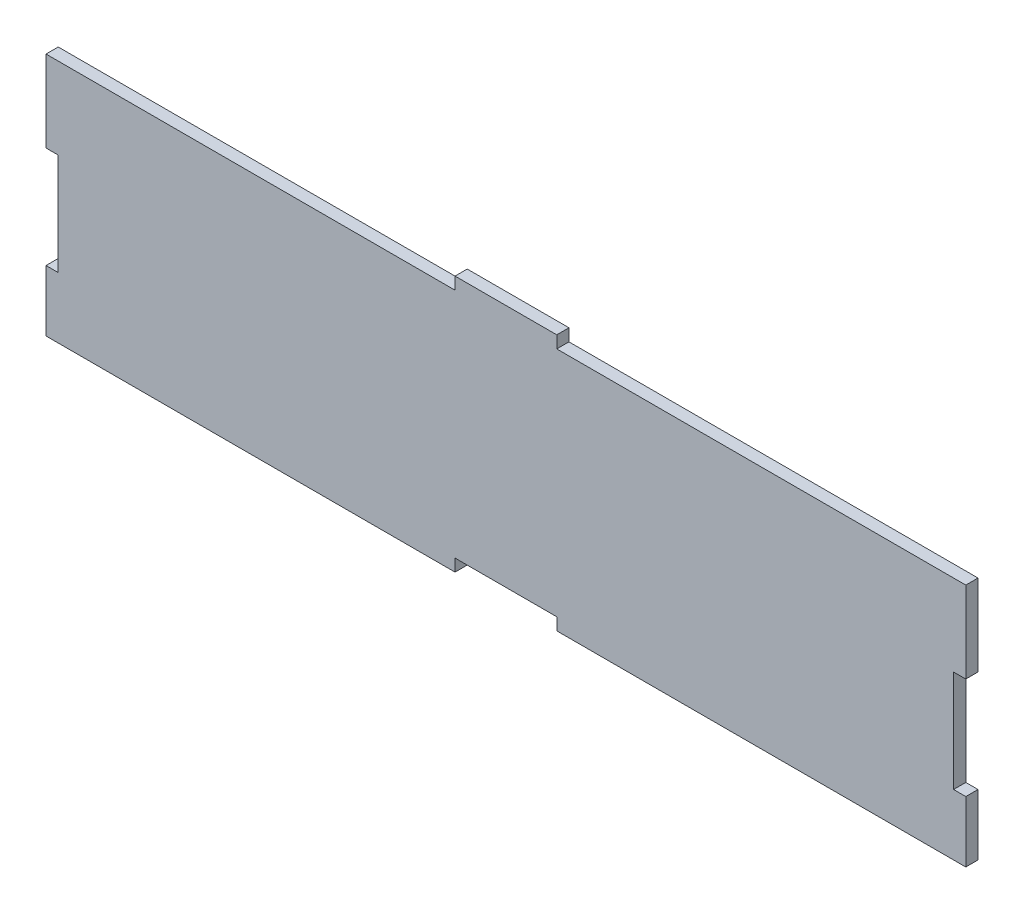
ISO-10303-21;
HEADER;
FILE_DESCRIPTION(('STEP AP214'),'2;1');
FILE_NAME('part.step','',(''),(''),'','','');
FILE_SCHEMA(('AUTOMOTIVE_DESIGN { 1 0 10303 214 1 1 1 1 }'));
ENDSEC;
DATA;
#1=APPLICATION_CONTEXT('core data for automotive mechanical design processes');
#2=APPLICATION_PROTOCOL_DEFINITION('international standard','automotive_design',2000,#1);
#3=PRODUCT_CONTEXT('',#1,'mechanical');
#4=PRODUCT('Part','Part','',(#3));
#5=PRODUCT_RELATED_PRODUCT_CATEGORY('part','',(#4));
#6=PRODUCT_DEFINITION_FORMATION('','',#4);
#7=PRODUCT_DEFINITION_CONTEXT('part definition',#1,'design');
#8=PRODUCT_DEFINITION('design','',#6,#7);
#9=PRODUCT_DEFINITION_SHAPE('','',#8);
#10=(LENGTH_UNIT() NAMED_UNIT(*) SI_UNIT(.MILLI.,.METRE.));
#11=(NAMED_UNIT(*) PLANE_ANGLE_UNIT() SI_UNIT($,.RADIAN.));
#12=(NAMED_UNIT(*) SI_UNIT($,.STERADIAN.) SOLID_ANGLE_UNIT());
#13=UNCERTAINTY_MEASURE_WITH_UNIT(LENGTH_MEASURE(1.E-05),#10,'distance_accuracy_value','');
#14=(GEOMETRIC_REPRESENTATION_CONTEXT(3) GLOBAL_UNCERTAINTY_ASSIGNED_CONTEXT((#13)) GLOBAL_UNIT_ASSIGNED_CONTEXT((#10,
#11,#12)) REPRESENTATION_CONTEXT('',''));
#15=CARTESIAN_POINT('',(0.,0.,0.));
#16=DIRECTION('',(0.,0.,1.));
#17=DIRECTION('',(1.,0.,0.));
#18=AXIS2_PLACEMENT_3D('',#15,#16,#17);
#19=CARTESIAN_POINT('',(-92.3153230930851,-18.9893617021276,3.));
#20=DIRECTION('',(1.,0.,0.));
#21=DIRECTION('',(0.,0.,-1.));
#22=AXIS2_PLACEMENT_3D('',#19,#20,#21);
#23=PLANE('',#22);
#24=DIRECTION('',(0.,-1.,0.));
#25=VECTOR('',#24,1.);
#26=CARTESIAN_POINT('',(-92.3153230930851,-18.9893617021276,0.));
#27=LINE('',#26,#25);
#28=CARTESIAN_POINT('',(-92.3153230930851,-18.9893617021276,0.));
#29=VERTEX_POINT('',#28);
#30=CARTESIAN_POINT('',(-92.3153230930851,-38.9893617021276,0.));
#31=VERTEX_POINT('',#30);
#32=EDGE_CURVE('E201',#29,#31,#27,.T.);
#33=ORIENTED_EDGE('',*,*,#32,.T.);
#34=DIRECTION('',(0.,0.,-1.));
#35=VECTOR('',#34,1.);
#36=CARTESIAN_POINT('',(-92.3153230930851,-38.9893617021276,3.));
#37=LINE('',#36,#35);
#38=CARTESIAN_POINT('',(-92.3153230930851,-38.9893617021276,3.));
#39=VERTEX_POINT('',#38);
#40=EDGE_CURVE('E11',#39,#31,#37,.T.);
#41=ORIENTED_EDGE('',*,*,#40,.F.);
#42=DIRECTION('',(0.,-1.,0.));
#43=VECTOR('',#42,1.);
#44=CARTESIAN_POINT('',(-92.3153230930851,-18.9893617021276,3.));
#45=LINE('',#44,#43);
#46=CARTESIAN_POINT('',(-92.3153230930851,-18.9893617021276,3.));
#47=VERTEX_POINT('',#46);
#48=EDGE_CURVE('E239',#47,#39,#45,.T.);
#49=ORIENTED_EDGE('',*,*,#48,.F.);
#50=DIRECTION('',(0.,0.,-1.));
#51=VECTOR('',#50,1.);
#52=CARTESIAN_POINT('',(-92.3153230930851,-18.9893617021276,3.));
#53=LINE('',#52,#51);
#54=EDGE_CURVE('E197',#47,#29,#53,.T.);
#55=ORIENTED_EDGE('',*,*,#54,.T.);
#56=EDGE_LOOP('',(#33,#41,#49,#55));
#57=FACE_BOUND('',#56,.T.);
#58=ADVANCED_FACE('F33',(#57),#23,.F.);
#59=CARTESIAN_POINT('',(-92.3153230930851,-38.9893617021276,3.));
#60=DIRECTION('',(0.,1.,0.));
#61=DIRECTION('',(0.,0.,1.));
#62=AXIS2_PLACEMENT_3D('',#59,#60,#61);
#63=PLANE('',#62);
#64=DIRECTION('',(1.,0.,0.));
#65=VECTOR('',#64,1.);
#66=CARTESIAN_POINT('',(-92.3153230930851,-38.9893617021276,0.));
#67=LINE('',#66,#65);
#68=CARTESIAN_POINT('',(-89.3153230930851,-38.9893617021276,0.));
#69=VERTEX_POINT('',#68);
#70=EDGE_CURVE('E204',#31,#69,#67,.T.);
#71=ORIENTED_EDGE('',*,*,#70,.T.);
#72=DIRECTION('',(0.,0.,-1.));
#73=VECTOR('',#72,1.);
#74=CARTESIAN_POINT('',(-89.3153230930851,-38.9893617021276,3.));
#75=LINE('',#74,#73);
#76=CARTESIAN_POINT('',(-89.3153230930851,-38.9893617021276,3.));
#77=VERTEX_POINT('',#76);
#78=EDGE_CURVE('E41',#77,#69,#75,.T.);
#79=ORIENTED_EDGE('',*,*,#78,.F.);
#80=DIRECTION('',(1.,0.,0.));
#81=VECTOR('',#80,1.);
#82=CARTESIAN_POINT('',(-92.3153230930851,-38.9893617021276,3.));
#83=LINE('',#82,#81);
#84=EDGE_CURVE('E128',#39,#77,#83,.T.);
#85=ORIENTED_EDGE('',*,*,#84,.F.);
#86=ORIENTED_EDGE('',*,*,#40,.T.);
#87=EDGE_LOOP('',(#71,#79,#85,#86));
#88=FACE_BOUND('',#87,.T.);
#89=ADVANCED_FACE('F357',(#88),#63,.F.);
#90=CARTESIAN_POINT('',(-89.3153230930851,-38.9893617021276,3.));
#91=DIRECTION('',(1.,0.,0.));
#92=DIRECTION('',(0.,0.,-1.));
#93=AXIS2_PLACEMENT_3D('',#90,#91,#92);
#94=PLANE('',#93);
#95=DIRECTION('',(0.,-1.,0.));
#96=VECTOR('',#95,1.);
#97=CARTESIAN_POINT('',(-89.3153230930851,-38.9893617021276,0.));
#98=LINE('',#97,#96);
#99=CARTESIAN_POINT('',(-89.3153230930851,-63.9893617021276,0.));
#100=VERTEX_POINT('',#99);
#101=EDGE_CURVE('E206',#69,#100,#98,.T.);
#102=ORIENTED_EDGE('',*,*,#101,.T.);
#103=DIRECTION('',(0.,0.,-1.));
#104=VECTOR('',#103,1.);
#105=CARTESIAN_POINT('',(-89.3153230930851,-63.9893617021276,3.));
#106=LINE('',#105,#104);
#107=CARTESIAN_POINT('',(-89.3153230930851,-63.9893617021276,3.));
#108=VERTEX_POINT('',#107);
#109=EDGE_CURVE('E282',#108,#100,#106,.T.);
#110=ORIENTED_EDGE('',*,*,#109,.F.);
#111=DIRECTION('',(0.,-1.,0.));
#112=VECTOR('',#111,1.);
#113=CARTESIAN_POINT('',(-89.3153230930851,-38.9893617021276,3.));
#114=LINE('',#113,#112);
#115=EDGE_CURVE('E290',#77,#108,#114,.T.);
#116=ORIENTED_EDGE('',*,*,#115,.F.);
#117=ORIENTED_EDGE('',*,*,#78,.T.);
#118=EDGE_LOOP('',(#102,#110,#116,#117));
#119=FACE_BOUND('',#118,.T.);
#120=ADVANCED_FACE('F288',(#119),#94,.F.);
#121=CARTESIAN_POINT('',(-92.3153230930851,-63.9893617021276,3.));
#122=DIRECTION('',(0.,-1.,0.));
#123=DIRECTION('',(0.,0.,-1.));
#124=AXIS2_PLACEMENT_3D('',#121,#122,#123);
#125=PLANE('',#124);
#126=DIRECTION('',(-1.,0.,0.));
#127=VECTOR('',#126,1.);
#128=CARTESIAN_POINT('',(-92.3153230930851,-63.9893617021276,0.));
#129=LINE('',#128,#127);
#130=CARTESIAN_POINT('',(-92.3153230930851,-63.9893617021276,0.));
#131=VERTEX_POINT('',#130);
#132=EDGE_CURVE('E208',#100,#131,#129,.T.);
#133=ORIENTED_EDGE('',*,*,#132,.T.);
#134=DIRECTION('',(0.,0.,-1.));
#135=VECTOR('',#134,1.);
#136=CARTESIAN_POINT('',(-92.3153230930851,-63.9893617021276,3.));
#137=LINE('',#136,#135);
#138=CARTESIAN_POINT('',(-92.3153230930851,-63.9893617021276,3.));
#139=VERTEX_POINT('',#138);
#140=EDGE_CURVE('E279',#139,#131,#137,.T.);
#141=ORIENTED_EDGE('',*,*,#140,.F.);
#142=DIRECTION('',(-1.,0.,0.));
#143=VECTOR('',#142,1.);
#144=CARTESIAN_POINT('',(-92.3153230930851,-63.9893617021276,3.));
#145=LINE('',#144,#143);
#146=EDGE_CURVE('E308',#108,#139,#145,.T.);
#147=ORIENTED_EDGE('',*,*,#146,.F.);
#148=ORIENTED_EDGE('',*,*,#109,.T.);
#149=EDGE_LOOP('',(#133,#141,#147,#148));
#150=FACE_BOUND('',#149,.T.);
#151=ADVANCED_FACE('F299',(#150),#125,.F.);
#152=CARTESIAN_POINT('',(-92.3153230930851,-63.9893617021276,3.));
#153=DIRECTION('',(1.,0.,0.));
#154=DIRECTION('',(0.,0.,-1.));
#155=AXIS2_PLACEMENT_3D('',#152,#153,#154);
#156=PLANE('',#155);
#157=DIRECTION('',(0.,-1.,0.));
#158=VECTOR('',#157,1.);
#159=CARTESIAN_POINT('',(-92.3153230930851,-63.9893617021276,0.));
#160=LINE('',#159,#158);
#161=CARTESIAN_POINT('',(-92.3153230930851,-78.9893617021276,0.));
#162=VERTEX_POINT('',#161);
#163=EDGE_CURVE('E210',#131,#162,#160,.T.);
#164=ORIENTED_EDGE('',*,*,#163,.T.);
#165=DIRECTION('',(0.,0.,-1.));
#166=VECTOR('',#165,1.);
#167=CARTESIAN_POINT('',(-92.3153230930851,-78.9893617021276,3.));
#168=LINE('',#167,#166);
#169=CARTESIAN_POINT('',(-92.3153230930851,-78.9893617021276,3.));
#170=VERTEX_POINT('',#169);
#171=EDGE_CURVE('E276',#170,#162,#168,.T.);
#172=ORIENTED_EDGE('',*,*,#171,.F.);
#173=DIRECTION('',(0.,-1.,0.));
#174=VECTOR('',#173,1.);
#175=CARTESIAN_POINT('',(-92.3153230930851,-63.9893617021276,3.));
#176=LINE('',#175,#174);
#177=EDGE_CURVE('E305',#139,#170,#176,.T.);
#178=ORIENTED_EDGE('',*,*,#177,.F.);
#179=ORIENTED_EDGE('',*,*,#140,.T.);
#180=EDGE_LOOP('',(#164,#172,#178,#179));
#181=FACE_BOUND('',#180,.T.);
#182=ADVANCED_FACE('F303',(#181),#156,.F.);
#183=CARTESIAN_POINT('',(-92.3153230930851,-78.9893617021276,3.));
#184=DIRECTION('',(0.,1.,0.));
#185=DIRECTION('',(0.,0.,1.));
#186=AXIS2_PLACEMENT_3D('',#183,#184,#185);
#187=PLANE('',#186);
#188=DIRECTION('',(1.,0.,0.));
#189=VECTOR('',#188,1.);
#190=CARTESIAN_POINT('',(-92.3153230930851,-78.9893617021276,0.));
#191=LINE('',#190,#189);
#192=CARTESIAN_POINT('',(8.18467690691486,-78.9893617021276,0.));
#193=VERTEX_POINT('',#192);
#194=EDGE_CURVE('E212',#162,#193,#191,.T.);
#195=ORIENTED_EDGE('',*,*,#194,.T.);
#196=DIRECTION('',(0.,0.,-1.));
#197=VECTOR('',#196,1.);
#198=CARTESIAN_POINT('',(8.18467690691486,-78.9893617021276,3.));
#199=LINE('',#198,#197);
#200=CARTESIAN_POINT('',(8.18467690691486,-78.9893617021276,3.));
#201=VERTEX_POINT('',#200);
#202=EDGE_CURVE('E273',#201,#193,#199,.T.);
#203=ORIENTED_EDGE('',*,*,#202,.F.);
#204=DIRECTION('',(1.,0.,0.));
#205=VECTOR('',#204,1.);
#206=CARTESIAN_POINT('',(-92.3153230930851,-78.9893617021276,3.));
#207=LINE('',#206,#205);
#208=EDGE_CURVE('E307',#170,#201,#207,.T.);
#209=ORIENTED_EDGE('',*,*,#208,.F.);
#210=ORIENTED_EDGE('',*,*,#171,.T.);
#211=EDGE_LOOP('',(#195,#203,#209,#210));
#212=FACE_BOUND('',#211,.T.);
#213=ADVANCED_FACE('F370',(#212),#187,.F.);
#214=CARTESIAN_POINT('',(8.18467690691486,-78.9893617021276,3.));
#215=DIRECTION('',(-1.,0.,0.));
#216=DIRECTION('',(0.,0.,1.));
#217=AXIS2_PLACEMENT_3D('',#214,#215,#216);
#218=PLANE('',#217);
#219=DIRECTION('',(0.,1.,0.));
#220=VECTOR('',#219,1.);
#221=CARTESIAN_POINT('',(8.18467690691486,-78.9893617021276,0.));
#222=LINE('',#221,#220);
#223=CARTESIAN_POINT('',(8.18467690691486,-75.9893617021276,0.));
#224=VERTEX_POINT('',#223);
#225=EDGE_CURVE('E214',#193,#224,#222,.T.);
#226=ORIENTED_EDGE('',*,*,#225,.T.);
#227=DIRECTION('',(0.,0.,-1.));
#228=VECTOR('',#227,1.);
#229=CARTESIAN_POINT('',(8.18467690691486,-75.9893617021276,3.));
#230=LINE('',#229,#228);
#231=CARTESIAN_POINT('',(8.18467690691486,-75.9893617021276,3.));
#232=VERTEX_POINT('',#231);
#233=EDGE_CURVE('E270',#232,#224,#230,.T.);
#234=ORIENTED_EDGE('',*,*,#233,.F.);
#235=DIRECTION('',(0.,1.,0.));
#236=VECTOR('',#235,1.);
#237=CARTESIAN_POINT('',(8.18467690691486,-78.9893617021276,3.));
#238=LINE('',#237,#236);
#239=EDGE_CURVE('E310',#201,#232,#238,.T.);
#240=ORIENTED_EDGE('',*,*,#239,.F.);
#241=ORIENTED_EDGE('',*,*,#202,.T.);
#242=EDGE_LOOP('',(#226,#234,#240,#241));
#243=FACE_BOUND('',#242,.T.);
#244=ADVANCED_FACE('F373',(#243),#218,.F.);
#245=CARTESIAN_POINT('',(8.18467690691486,-75.9893617021276,3.));
#246=DIRECTION('',(0.,1.,0.));
#247=DIRECTION('',(0.,0.,1.));
#248=AXIS2_PLACEMENT_3D('',#245,#246,#247);
#249=PLANE('',#248);
#250=DIRECTION('',(1.,0.,0.));
#251=VECTOR('',#250,1.);
#252=CARTESIAN_POINT('',(8.18467690691486,-75.9893617021276,0.));
#253=LINE('',#252,#251);
#254=CARTESIAN_POINT('',(33.1846769069149,-75.9893617021276,0.));
#255=VERTEX_POINT('',#254);
#256=EDGE_CURVE('E216',#224,#255,#253,.T.);
#257=ORIENTED_EDGE('',*,*,#256,.T.);
#258=DIRECTION('',(0.,0.,-1.));
#259=VECTOR('',#258,1.);
#260=CARTESIAN_POINT('',(33.1846769069149,-75.9893617021276,3.));
#261=LINE('',#260,#259);
#262=CARTESIAN_POINT('',(33.1846769069149,-75.9893617021276,3.));
#263=VERTEX_POINT('',#262);
#264=EDGE_CURVE('E267',#263,#255,#261,.T.);
#265=ORIENTED_EDGE('',*,*,#264,.F.);
#266=DIRECTION('',(1.,0.,0.));
#267=VECTOR('',#266,1.);
#268=CARTESIAN_POINT('',(8.18467690691486,-75.9893617021276,3.));
#269=LINE('',#268,#267);
#270=EDGE_CURVE('E316',#232,#263,#269,.T.);
#271=ORIENTED_EDGE('',*,*,#270,.F.);
#272=ORIENTED_EDGE('',*,*,#233,.T.);
#273=EDGE_LOOP('',(#257,#265,#271,#272));
#274=FACE_BOUND('',#273,.T.);
#275=ADVANCED_FACE('F377',(#274),#249,.F.);
#276=CARTESIAN_POINT('',(33.1846769069149,-78.9893617021276,3.));
#277=DIRECTION('',(1.,0.,0.));
#278=DIRECTION('',(0.,0.,-1.));
#279=AXIS2_PLACEMENT_3D('',#276,#277,#278);
#280=PLANE('',#279);
#281=DIRECTION('',(0.,-1.,0.));
#282=VECTOR('',#281,1.);
#283=CARTESIAN_POINT('',(33.1846769069149,-78.9893617021276,0.));
#284=LINE('',#283,#282);
#285=CARTESIAN_POINT('',(33.1846769069149,-78.9893617021276,0.));
#286=VERTEX_POINT('',#285);
#287=EDGE_CURVE('E218',#255,#286,#284,.T.);
#288=ORIENTED_EDGE('',*,*,#287,.T.);
#289=DIRECTION('',(0.,0.,-1.));
#290=VECTOR('',#289,1.);
#291=CARTESIAN_POINT('',(33.1846769069149,-78.9893617021276,3.));
#292=LINE('',#291,#290);
#293=CARTESIAN_POINT('',(33.1846769069149,-78.9893617021276,3.));
#294=VERTEX_POINT('',#293);
#295=EDGE_CURVE('E264',#294,#286,#292,.T.);
#296=ORIENTED_EDGE('',*,*,#295,.F.);
#297=DIRECTION('',(0.,-1.,0.));
#298=VECTOR('',#297,1.);
#299=CARTESIAN_POINT('',(33.1846769069149,-78.9893617021276,3.));
#300=LINE('',#299,#298);
#301=EDGE_CURVE('E318',#263,#294,#300,.T.);
#302=ORIENTED_EDGE('',*,*,#301,.F.);
#303=ORIENTED_EDGE('',*,*,#264,.T.);
#304=EDGE_LOOP('',(#288,#296,#302,#303));
#305=FACE_BOUND('',#304,.T.);
#306=ADVANCED_FACE('F381',(#305),#280,.F.);
#307=CARTESIAN_POINT('',(33.1846769069149,-78.9893617021276,3.));
#308=DIRECTION('',(0.,1.,0.));
#309=DIRECTION('',(0.,0.,1.));
#310=AXIS2_PLACEMENT_3D('',#307,#308,#309);
#311=PLANE('',#310);
#312=DIRECTION('',(1.,0.,0.));
#313=VECTOR('',#312,1.);
#314=CARTESIAN_POINT('',(33.1846769069149,-78.9893617021276,0.));
#315=LINE('',#314,#313);
#316=CARTESIAN_POINT('',(133.684676906915,-78.9893617021276,0.));
#317=VERTEX_POINT('',#316);
#318=EDGE_CURVE('E220',#286,#317,#315,.T.);
#319=ORIENTED_EDGE('',*,*,#318,.T.);
#320=DIRECTION('',(0.,0.,-1.));
#321=VECTOR('',#320,1.);
#322=CARTESIAN_POINT('',(133.684676906915,-78.9893617021276,3.));
#323=LINE('',#322,#321);
#324=CARTESIAN_POINT('',(133.684676906915,-78.9893617021276,3.));
#325=VERTEX_POINT('',#324);
#326=EDGE_CURVE('E261',#325,#317,#323,.T.);
#327=ORIENTED_EDGE('',*,*,#326,.F.);
#328=DIRECTION('',(1.,0.,0.));
#329=VECTOR('',#328,1.);
#330=CARTESIAN_POINT('',(33.1846769069149,-78.9893617021276,3.));
#331=LINE('',#330,#329);
#332=EDGE_CURVE('E320',#294,#325,#331,.T.);
#333=ORIENTED_EDGE('',*,*,#332,.F.);
#334=ORIENTED_EDGE('',*,*,#295,.T.);
#335=EDGE_LOOP('',(#319,#327,#333,#334));
#336=FACE_BOUND('',#335,.T.);
#337=ADVANCED_FACE('F385',(#336),#311,.F.);
#338=CARTESIAN_POINT('',(133.684676906915,-63.9893617021276,3.));
#339=DIRECTION('',(-1.,0.,0.));
#340=DIRECTION('',(0.,0.,1.));
#341=AXIS2_PLACEMENT_3D('',#338,#339,#340);
#342=PLANE('',#341);
#343=DIRECTION('',(0.,1.,0.));
#344=VECTOR('',#343,1.);
#345=CARTESIAN_POINT('',(133.684676906915,-63.9893617021276,0.));
#346=LINE('',#345,#344);
#347=CARTESIAN_POINT('',(133.684676906915,-63.9893617021276,0.));
#348=VERTEX_POINT('',#347);
#349=EDGE_CURVE('E222',#317,#348,#346,.T.);
#350=ORIENTED_EDGE('',*,*,#349,.T.);
#351=DIRECTION('',(0.,0.,-1.));
#352=VECTOR('',#351,1.);
#353=CARTESIAN_POINT('',(133.684676906915,-63.9893617021276,3.));
#354=LINE('',#353,#352);
#355=CARTESIAN_POINT('',(133.684676906915,-63.9893617021276,3.));
#356=VERTEX_POINT('',#355);
#357=EDGE_CURVE('E258',#356,#348,#354,.T.);
#358=ORIENTED_EDGE('',*,*,#357,.F.);
#359=DIRECTION('',(0.,1.,0.));
#360=VECTOR('',#359,1.);
#361=CARTESIAN_POINT('',(133.684676906915,-63.9893617021276,3.));
#362=LINE('',#361,#360);
#363=EDGE_CURVE('E322',#325,#356,#362,.T.);
#364=ORIENTED_EDGE('',*,*,#363,.F.);
#365=ORIENTED_EDGE('',*,*,#326,.T.);
#366=EDGE_LOOP('',(#350,#358,#364,#365));
#367=FACE_BOUND('',#366,.T.);
#368=ADVANCED_FACE('F389',(#367),#342,.F.);
#369=CARTESIAN_POINT('',(133.684676906915,-63.9893617021276,3.));
#370=DIRECTION('',(0.,-1.,0.));
#371=DIRECTION('',(0.,0.,-1.));
#372=AXIS2_PLACEMENT_3D('',#369,#370,#371);
#373=PLANE('',#372);
#374=DIRECTION('',(-1.,0.,0.));
#375=VECTOR('',#374,1.);
#376=CARTESIAN_POINT('',(133.684676906915,-63.9893617021276,0.));
#377=LINE('',#376,#375);
#378=CARTESIAN_POINT('',(130.684676906915,-63.9893617021276,0.));
#379=VERTEX_POINT('',#378);
#380=EDGE_CURVE('E224',#348,#379,#377,.T.);
#381=ORIENTED_EDGE('',*,*,#380,.T.);
#382=DIRECTION('',(0.,0.,-1.));
#383=VECTOR('',#382,1.);
#384=CARTESIAN_POINT('',(130.684676906915,-63.9893617021276,3.));
#385=LINE('',#384,#383);
#386=CARTESIAN_POINT('',(130.684676906915,-63.9893617021276,3.));
#387=VERTEX_POINT('',#386);
#388=EDGE_CURVE('E255',#387,#379,#385,.T.);
#389=ORIENTED_EDGE('',*,*,#388,.F.);
#390=DIRECTION('',(-1.,0.,0.));
#391=VECTOR('',#390,1.);
#392=CARTESIAN_POINT('',(133.684676906915,-63.9893617021276,3.));
#393=LINE('',#392,#391);
#394=EDGE_CURVE('E324',#356,#387,#393,.T.);
#395=ORIENTED_EDGE('',*,*,#394,.F.);
#396=ORIENTED_EDGE('',*,*,#357,.T.);
#397=EDGE_LOOP('',(#381,#389,#395,#396));
#398=FACE_BOUND('',#397,.T.);
#399=ADVANCED_FACE('F393',(#398),#373,.F.);
#400=CARTESIAN_POINT('',(130.684676906915,-38.9893617021276,3.));
#401=DIRECTION('',(-1.,0.,0.));
#402=DIRECTION('',(0.,0.,1.));
#403=AXIS2_PLACEMENT_3D('',#400,#401,#402);
#404=PLANE('',#403);
#405=DIRECTION('',(0.,1.,0.));
#406=VECTOR('',#405,1.);
#407=CARTESIAN_POINT('',(130.684676906915,-38.9893617021276,0.));
#408=LINE('',#407,#406);
#409=CARTESIAN_POINT('',(130.684676906915,-38.9893617021276,0.));
#410=VERTEX_POINT('',#409);
#411=EDGE_CURVE('E226',#379,#410,#408,.T.);
#412=ORIENTED_EDGE('',*,*,#411,.T.);
#413=DIRECTION('',(0.,0.,-1.));
#414=VECTOR('',#413,1.);
#415=CARTESIAN_POINT('',(130.684676906915,-38.9893617021276,3.));
#416=LINE('',#415,#414);
#417=CARTESIAN_POINT('',(130.684676906915,-38.9893617021276,3.));
#418=VERTEX_POINT('',#417);
#419=EDGE_CURVE('E252',#418,#410,#416,.T.);
#420=ORIENTED_EDGE('',*,*,#419,.F.);
#421=DIRECTION('',(0.,1.,0.));
#422=VECTOR('',#421,1.);
#423=CARTESIAN_POINT('',(130.684676906915,-38.9893617021276,3.));
#424=LINE('',#423,#422);
#425=EDGE_CURVE('E326',#387,#418,#424,.T.);
#426=ORIENTED_EDGE('',*,*,#425,.F.);
#427=ORIENTED_EDGE('',*,*,#388,.T.);
#428=EDGE_LOOP('',(#412,#420,#426,#427));
#429=FACE_BOUND('',#428,.T.);
#430=ADVANCED_FACE('F397',(#429),#404,.F.);
#431=CARTESIAN_POINT('',(133.684676906915,-38.9893617021276,3.));
#432=DIRECTION('',(0.,1.,0.));
#433=DIRECTION('',(0.,0.,1.));
#434=AXIS2_PLACEMENT_3D('',#431,#432,#433);
#435=PLANE('',#434);
#436=DIRECTION('',(1.,0.,0.));
#437=VECTOR('',#436,1.);
#438=CARTESIAN_POINT('',(133.684676906915,-38.9893617021276,0.));
#439=LINE('',#438,#437);
#440=CARTESIAN_POINT('',(133.684676906915,-38.9893617021276,0.));
#441=VERTEX_POINT('',#440);
#442=EDGE_CURVE('E228',#410,#441,#439,.T.);
#443=ORIENTED_EDGE('',*,*,#442,.T.);
#444=DIRECTION('',(0.,0.,-1.));
#445=VECTOR('',#444,1.);
#446=CARTESIAN_POINT('',(133.684676906915,-38.9893617021276,3.));
#447=LINE('',#446,#445);
#448=CARTESIAN_POINT('',(133.684676906915,-38.9893617021276,3.));
#449=VERTEX_POINT('',#448);
#450=EDGE_CURVE('E249',#449,#441,#447,.T.);
#451=ORIENTED_EDGE('',*,*,#450,.F.);
#452=DIRECTION('',(1.,0.,0.));
#453=VECTOR('',#452,1.);
#454=CARTESIAN_POINT('',(133.684676906915,-38.9893617021276,3.));
#455=LINE('',#454,#453);
#456=EDGE_CURVE('E328',#418,#449,#455,.T.);
#457=ORIENTED_EDGE('',*,*,#456,.F.);
#458=ORIENTED_EDGE('',*,*,#419,.T.);
#459=EDGE_LOOP('',(#443,#451,#457,#458));
#460=FACE_BOUND('',#459,.T.);
#461=ADVANCED_FACE('F401',(#460),#435,.F.);
#462=CARTESIAN_POINT('',(133.684676906915,-18.9893617021276,3.));
#463=DIRECTION('',(-1.,0.,0.));
#464=DIRECTION('',(0.,0.,1.));
#465=AXIS2_PLACEMENT_3D('',#462,#463,#464);
#466=PLANE('',#465);
#467=DIRECTION('',(0.,1.,0.));
#468=VECTOR('',#467,1.);
#469=CARTESIAN_POINT('',(133.684676906915,-18.9893617021276,0.));
#470=LINE('',#469,#468);
#471=CARTESIAN_POINT('',(133.684676906915,-18.9893617021276,0.));
#472=VERTEX_POINT('',#471);
#473=EDGE_CURVE('E230',#441,#472,#470,.T.);
#474=ORIENTED_EDGE('',*,*,#473,.T.);
#475=DIRECTION('',(0.,0.,-1.));
#476=VECTOR('',#475,1.);
#477=CARTESIAN_POINT('',(133.684676906915,-18.9893617021276,3.));
#478=LINE('',#477,#476);
#479=CARTESIAN_POINT('',(133.684676906915,-18.9893617021276,3.));
#480=VERTEX_POINT('',#479);
#481=EDGE_CURVE('E246',#480,#472,#478,.T.);
#482=ORIENTED_EDGE('',*,*,#481,.F.);
#483=DIRECTION('',(0.,1.,0.));
#484=VECTOR('',#483,1.);
#485=CARTESIAN_POINT('',(133.684676906915,-18.9893617021276,3.));
#486=LINE('',#485,#484);
#487=EDGE_CURVE('E330',#449,#480,#486,.T.);
#488=ORIENTED_EDGE('',*,*,#487,.F.);
#489=ORIENTED_EDGE('',*,*,#450,.T.);
#490=EDGE_LOOP('',(#474,#482,#488,#489));
#491=FACE_BOUND('',#490,.T.);
#492=ADVANCED_FACE('F405',(#491),#466,.F.);
#493=CARTESIAN_POINT('',(33.1846769069149,-18.9893617021276,3.));
#494=DIRECTION('',(0.,-1.,0.));
#495=DIRECTION('',(0.,0.,-1.));
#496=AXIS2_PLACEMENT_3D('',#493,#494,#495);
#497=PLANE('',#496);
#498=DIRECTION('',(-1.,0.,0.));
#499=VECTOR('',#498,1.);
#500=CARTESIAN_POINT('',(33.1846769069149,-18.9893617021276,0.));
#501=LINE('',#500,#499);
#502=CARTESIAN_POINT('',(33.1846769069149,-18.9893617021276,0.));
#503=VERTEX_POINT('',#502);
#504=EDGE_CURVE('E232',#472,#503,#501,.T.);
#505=ORIENTED_EDGE('',*,*,#504,.T.);
#506=DIRECTION('',(0.,0.,-1.));
#507=VECTOR('',#506,1.);
#508=CARTESIAN_POINT('',(33.1846769069149,-18.9893617021276,3.));
#509=LINE('',#508,#507);
#510=CARTESIAN_POINT('',(33.1846769069149,-18.9893617021276,3.));
#511=VERTEX_POINT('',#510);
#512=EDGE_CURVE('E243',#511,#503,#509,.T.);
#513=ORIENTED_EDGE('',*,*,#512,.F.);
#514=DIRECTION('',(-1.,0.,0.));
#515=VECTOR('',#514,1.);
#516=CARTESIAN_POINT('',(33.1846769069149,-18.9893617021276,3.));
#517=LINE('',#516,#515);
#518=EDGE_CURVE('E332',#480,#511,#517,.T.);
#519=ORIENTED_EDGE('',*,*,#518,.F.);
#520=ORIENTED_EDGE('',*,*,#481,.T.);
#521=EDGE_LOOP('',(#505,#513,#519,#520));
#522=FACE_BOUND('',#521,.T.);
#523=ADVANCED_FACE('F338',(#522),#497,.F.);
#524=CARTESIAN_POINT('',(33.1846769069149,-18.9893617021276,3.));
#525=DIRECTION('',(-1.,0.,0.));
#526=DIRECTION('',(0.,0.,1.));
#527=AXIS2_PLACEMENT_3D('',#524,#525,#526);
#528=PLANE('',#527);
#529=DIRECTION('',(0.,1.,0.));
#530=VECTOR('',#529,1.);
#531=CARTESIAN_POINT('',(33.1846769069149,-18.9893617021276,0.));
#532=LINE('',#531,#530);
#533=CARTESIAN_POINT('',(33.1846769069149,-15.9893617021276,0.));
#534=VERTEX_POINT('',#533);
#535=EDGE_CURVE('E234',#503,#534,#532,.T.);
#536=ORIENTED_EDGE('',*,*,#535,.T.);
#537=DIRECTION('',(0.,0.,-1.));
#538=VECTOR('',#537,1.);
#539=CARTESIAN_POINT('',(33.1846769069149,-15.9893617021276,3.));
#540=LINE('',#539,#538);
#541=CARTESIAN_POINT('',(33.1846769069149,-15.9893617021276,3.));
#542=VERTEX_POINT('',#541);
#543=EDGE_CURVE('E192',#542,#534,#540,.T.);
#544=ORIENTED_EDGE('',*,*,#543,.F.);
#545=DIRECTION('',(0.,1.,0.));
#546=VECTOR('',#545,1.);
#547=CARTESIAN_POINT('',(33.1846769069149,-18.9893617021276,3.));
#548=LINE('',#547,#546);
#549=EDGE_CURVE('E183',#511,#542,#548,.T.);
#550=ORIENTED_EDGE('',*,*,#549,.F.);
#551=ORIENTED_EDGE('',*,*,#512,.T.);
#552=EDGE_LOOP('',(#536,#544,#550,#551));
#553=FACE_BOUND('',#552,.T.);
#554=ADVANCED_FACE('F342',(#553),#528,.F.);
#555=CARTESIAN_POINT('',(8.18467690691487,-15.9893617021276,3.));
#556=DIRECTION('',(0.,-1.,0.));
#557=DIRECTION('',(0.,0.,-1.));
#558=AXIS2_PLACEMENT_3D('',#555,#556,#557);
#559=PLANE('',#558);
#560=DIRECTION('',(-1.,0.,0.));
#561=VECTOR('',#560,1.);
#562=CARTESIAN_POINT('',(8.18467690691487,-15.9893617021276,0.));
#563=LINE('',#562,#561);
#564=CARTESIAN_POINT('',(8.18467690691487,-15.9893617021276,0.));
#565=VERTEX_POINT('',#564);
#566=EDGE_CURVE('E191',#534,#565,#563,.T.);
#567=ORIENTED_EDGE('',*,*,#566,.T.);
#568=DIRECTION('',(0.,0.,-1.));
#569=VECTOR('',#568,1.);
#570=CARTESIAN_POINT('',(8.18467690691487,-15.9893617021276,3.));
#571=LINE('',#570,#569);
#572=CARTESIAN_POINT('',(8.18467690691487,-15.9893617021276,3.));
#573=VERTEX_POINT('',#572);
#574=EDGE_CURVE('E188',#573,#565,#571,.T.);
#575=ORIENTED_EDGE('',*,*,#574,.F.);
#576=DIRECTION('',(-1.,0.,0.));
#577=VECTOR('',#576,1.);
#578=CARTESIAN_POINT('',(8.18467690691487,-15.9893617021276,3.));
#579=LINE('',#578,#577);
#580=EDGE_CURVE('E177',#542,#573,#579,.T.);
#581=ORIENTED_EDGE('',*,*,#580,.F.);
#582=ORIENTED_EDGE('',*,*,#543,.T.);
#583=EDGE_LOOP('',(#567,#575,#581,#582));
#584=FACE_BOUND('',#583,.T.);
#585=ADVANCED_FACE('F189',(#584),#559,.F.);
#586=CARTESIAN_POINT('',(8.18467690691487,-18.9893617021276,3.));
#587=DIRECTION('',(1.,0.,0.));
#588=DIRECTION('',(0.,0.,-1.));
#589=AXIS2_PLACEMENT_3D('',#586,#587,#588);
#590=PLANE('',#589);
#591=DIRECTION('',(0.,-1.,0.));
#592=VECTOR('',#591,1.);
#593=CARTESIAN_POINT('',(8.18467690691487,-18.9893617021276,0.));
#594=LINE('',#593,#592);
#595=CARTESIAN_POINT('',(8.18467690691487,-18.9893617021276,0.));
#596=VERTEX_POINT('',#595);
#597=EDGE_CURVE('E114',#565,#596,#594,.T.);
#598=ORIENTED_EDGE('',*,*,#597,.T.);
#599=DIRECTION('',(0.,0.,-1.));
#600=VECTOR('',#599,1.);
#601=CARTESIAN_POINT('',(8.18467690691487,-18.9893617021276,3.));
#602=LINE('',#601,#600);
#603=CARTESIAN_POINT('',(8.18467690691487,-18.9893617021276,3.));
#604=VERTEX_POINT('',#603);
#605=EDGE_CURVE('E193',#604,#596,#602,.T.);
#606=ORIENTED_EDGE('',*,*,#605,.F.);
#607=DIRECTION('',(0.,-1.,0.));
#608=VECTOR('',#607,1.);
#609=CARTESIAN_POINT('',(8.18467690691487,-18.9893617021276,3.));
#610=LINE('',#609,#608);
#611=EDGE_CURVE('E181',#573,#604,#610,.T.);
#612=ORIENTED_EDGE('',*,*,#611,.F.);
#613=ORIENTED_EDGE('',*,*,#574,.T.);
#614=EDGE_LOOP('',(#598,#606,#612,#613));
#615=FACE_BOUND('',#614,.T.);
#616=ADVANCED_FACE('F195',(#615),#590,.F.);
#617=CARTESIAN_POINT('',(-92.3153230930851,-18.9893617021276,3.));
#618=DIRECTION('',(0.,-1.,0.));
#619=DIRECTION('',(0.,0.,-1.));
#620=AXIS2_PLACEMENT_3D('',#617,#618,#619);
#621=PLANE('',#620);
#622=DIRECTION('',(-1.,0.,0.));
#623=VECTOR('',#622,1.);
#624=CARTESIAN_POINT('',(-92.3153230930851,-18.9893617021276,0.));
#625=LINE('',#624,#623);
#626=EDGE_CURVE('E120',#596,#29,#625,.T.);
#627=ORIENTED_EDGE('',*,*,#626,.T.);
#628=ORIENTED_EDGE('',*,*,#54,.F.);
#629=DIRECTION('',(-1.,0.,0.));
#630=VECTOR('',#629,1.);
#631=CARTESIAN_POINT('',(-92.3153230930851,-18.9893617021276,3.));
#632=LINE('',#631,#630);
#633=EDGE_CURVE('E49',#604,#47,#632,.T.);
#634=ORIENTED_EDGE('',*,*,#633,.F.);
#635=ORIENTED_EDGE('',*,*,#605,.T.);
#636=EDGE_LOOP('',(#627,#628,#634,#635));
#637=FACE_BOUND('',#636,.T.);
#638=ADVANCED_FACE('F346',(#637),#621,.F.);
#639=CARTESIAN_POINT('',(0.,0.,3.));
#640=DIRECTION('',(0.,0.,1.));
#641=DIRECTION('',(1.,0.,0.));
#642=AXIS2_PLACEMENT_3D('',#639,#640,#641);
#643=PLANE('',#642);
#644=ORIENTED_EDGE('',*,*,#48,.T.);
#645=ORIENTED_EDGE('',*,*,#84,.T.);
#646=ORIENTED_EDGE('',*,*,#115,.T.);
#647=ORIENTED_EDGE('',*,*,#146,.T.);
#648=ORIENTED_EDGE('',*,*,#177,.T.);
#649=ORIENTED_EDGE('',*,*,#208,.T.);
#650=ORIENTED_EDGE('',*,*,#239,.T.);
#651=ORIENTED_EDGE('',*,*,#270,.T.);
#652=ORIENTED_EDGE('',*,*,#301,.T.);
#653=ORIENTED_EDGE('',*,*,#332,.T.);
#654=ORIENTED_EDGE('',*,*,#363,.T.);
#655=ORIENTED_EDGE('',*,*,#394,.T.);
#656=ORIENTED_EDGE('',*,*,#425,.T.);
#657=ORIENTED_EDGE('',*,*,#456,.T.);
#658=ORIENTED_EDGE('',*,*,#487,.T.);
#659=ORIENTED_EDGE('',*,*,#518,.T.);
#660=ORIENTED_EDGE('',*,*,#549,.T.);
#661=ORIENTED_EDGE('',*,*,#580,.T.);
#662=ORIENTED_EDGE('',*,*,#611,.T.);
#663=ORIENTED_EDGE('',*,*,#633,.T.);
#664=EDGE_LOOP('',(#644,#645,#646,#647,#648,#649,#650,#651,#652,#653,#654,#655,#656,#657,#658,
#659,#660,#661,#662,#663));
#665=FACE_BOUND('',#664,.T.);
#666=ADVANCED_FACE('F179',(#665),#643,.T.);
#667=CARTESIAN_POINT('',(0.,0.,0.));
#668=DIRECTION('',(0.,0.,1.));
#669=DIRECTION('',(1.,0.,0.));
#670=AXIS2_PLACEMENT_3D('',#667,#668,#669);
#671=PLANE('',#670);
#672=ORIENTED_EDGE('',*,*,#32,.F.);
#673=ORIENTED_EDGE('',*,*,#626,.F.);
#674=ORIENTED_EDGE('',*,*,#597,.F.);
#675=ORIENTED_EDGE('',*,*,#566,.F.);
#676=ORIENTED_EDGE('',*,*,#535,.F.);
#677=ORIENTED_EDGE('',*,*,#504,.F.);
#678=ORIENTED_EDGE('',*,*,#473,.F.);
#679=ORIENTED_EDGE('',*,*,#442,.F.);
#680=ORIENTED_EDGE('',*,*,#411,.F.);
#681=ORIENTED_EDGE('',*,*,#380,.F.);
#682=ORIENTED_EDGE('',*,*,#349,.F.);
#683=ORIENTED_EDGE('',*,*,#318,.F.);
#684=ORIENTED_EDGE('',*,*,#287,.F.);
#685=ORIENTED_EDGE('',*,*,#256,.F.);
#686=ORIENTED_EDGE('',*,*,#225,.F.);
#687=ORIENTED_EDGE('',*,*,#194,.F.);
#688=ORIENTED_EDGE('',*,*,#163,.F.);
#689=ORIENTED_EDGE('',*,*,#132,.F.);
#690=ORIENTED_EDGE('',*,*,#101,.F.);
#691=ORIENTED_EDGE('',*,*,#70,.F.);
#692=EDGE_LOOP('',(#672,#673,#674,#675,#676,#677,#678,#679,#680,#681,#682,#683,#684,#685,#686,
#687,#688,#689,#690,#691));
#693=FACE_BOUND('',#692,.T.);
#694=ADVANCED_FACE('F294',(#693),#671,.F.);
#695=CLOSED_SHELL('',(#58,#89,#120,#151,#182,#213,#244,#275,#306,#337,#368,#399,#430,#461,#492,
#523,#554,#585,#616,#638,#666,#694));
#696=MANIFOLD_SOLID_BREP('B2',#695);
#697=ADVANCED_BREP_SHAPE_REPRESENTATION('',(#18,#696),#14);
#698=SHAPE_DEFINITION_REPRESENTATION(#9,#697);
ENDSEC;
END-ISO-10303-21;
